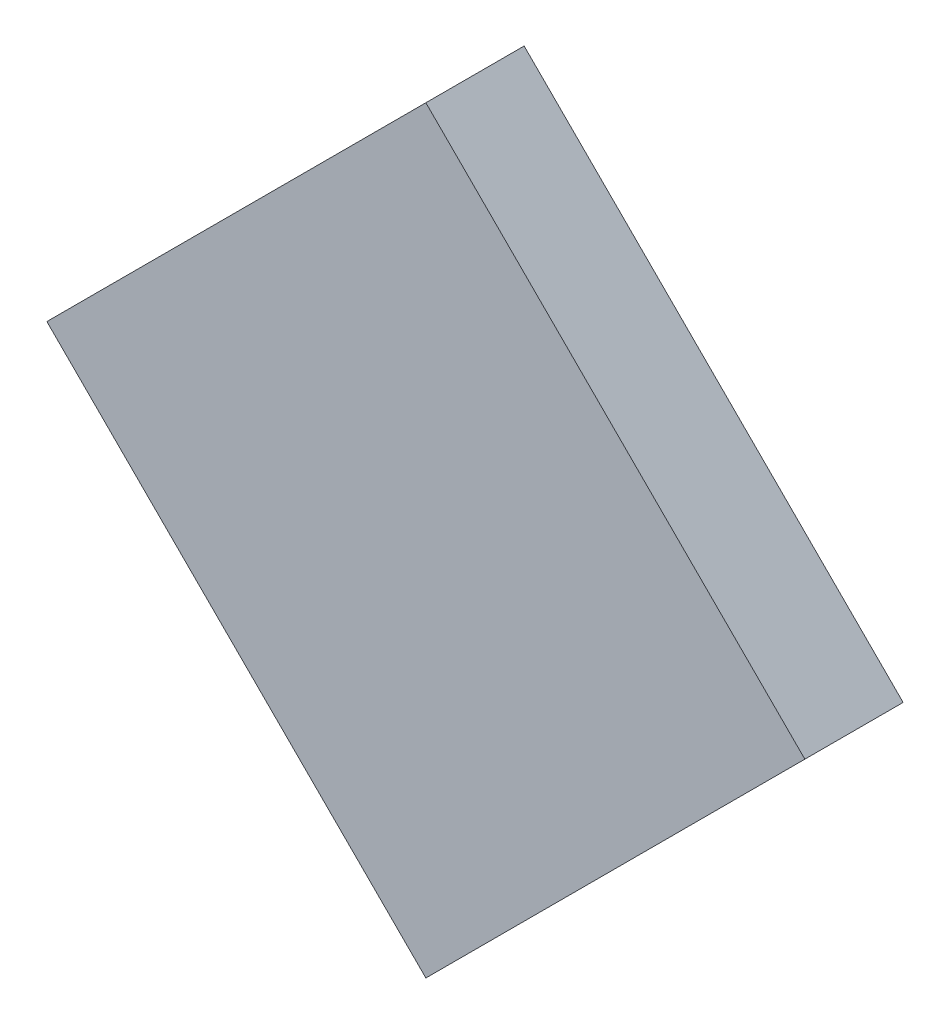
ISO-10303-21;
HEADER;
FILE_DESCRIPTION(('STEP AP214'),'2;1');
FILE_NAME('part.step','',(''),(''),'','','');
FILE_SCHEMA(('AUTOMOTIVE_DESIGN { 1 0 10303 214 1 1 1 1 }'));
ENDSEC;
DATA;
#1=APPLICATION_CONTEXT('core data for automotive mechanical design processes');
#2=APPLICATION_PROTOCOL_DEFINITION('international standard','automotive_design',2000,#1);
#3=PRODUCT_CONTEXT('',#1,'mechanical');
#4=PRODUCT('Part','Part','',(#3));
#5=PRODUCT_RELATED_PRODUCT_CATEGORY('part','',(#4));
#6=PRODUCT_DEFINITION_FORMATION('','',#4);
#7=PRODUCT_DEFINITION_CONTEXT('part definition',#1,'design');
#8=PRODUCT_DEFINITION('design','',#6,#7);
#9=PRODUCT_DEFINITION_SHAPE('','',#8);
#10=(LENGTH_UNIT() NAMED_UNIT(*) SI_UNIT(.MILLI.,.METRE.));
#11=(NAMED_UNIT(*) PLANE_ANGLE_UNIT() SI_UNIT($,.RADIAN.));
#12=(NAMED_UNIT(*) SI_UNIT($,.STERADIAN.) SOLID_ANGLE_UNIT());
#13=UNCERTAINTY_MEASURE_WITH_UNIT(LENGTH_MEASURE(1.E-05),#10,'distance_accuracy_value','');
#14=(GEOMETRIC_REPRESENTATION_CONTEXT(3) GLOBAL_UNCERTAINTY_ASSIGNED_CONTEXT((#13)) GLOBAL_UNIT_ASSIGNED_CONTEXT((#10,
#11,#12)) REPRESENTATION_CONTEXT('',''));
#15=CARTESIAN_POINT('',(0.,0.,0.));
#16=DIRECTION('',(0.,0.,1.));
#17=DIRECTION('',(1.,0.,0.));
#18=AXIS2_PLACEMENT_3D('',#15,#16,#17);
#19=CARTESIAN_POINT('',(212.573593128807,127.720779386421,92.));
#20=DIRECTION('',(0.707106781186547,-0.707106781186548,0.));
#21=DIRECTION('',(0.,0.,-1.));
#22=AXIS2_PLACEMENT_3D('',#19,#20,#21);
#23=PLANE('',#22);
#24=DIRECTION('',(-0.707106781186548,-0.707106781186547,0.));
#25=VECTOR('',#24,1.);
#26=CARTESIAN_POINT('',(297.426406871193,212.573593128807,92.));
#27=LINE('',#26,#25);
#28=CARTESIAN_POINT('',(297.426406871193,212.573593128807,92.));
#29=VERTEX_POINT('',#28);
#30=CARTESIAN_POINT('',(212.573593128807,127.720779386421,92.));
#31=VERTEX_POINT('',#30);
#32=EDGE_CURVE('E20',#29,#31,#27,.T.);
#33=ORIENTED_EDGE('',*,*,#32,.F.);
#34=DIRECTION('',(0.,0.,1.));
#35=VECTOR('',#34,1.);
#36=CARTESIAN_POINT('',(297.426406871193,212.573593128807,92.));
#37=LINE('',#36,#35);
#38=CARTESIAN_POINT('',(297.426406871193,212.573593128807,114.));
#39=VERTEX_POINT('',#38);
#40=EDGE_CURVE('E11',#29,#39,#37,.T.);
#41=ORIENTED_EDGE('',*,*,#40,.T.);
#42=DIRECTION('',(0.707106781186548,0.707106781186547,0.));
#43=VECTOR('',#42,1.);
#44=CARTESIAN_POINT('',(297.426406871193,212.573593128807,114.));
#45=LINE('',#44,#43);
#46=CARTESIAN_POINT('',(212.573593128807,127.720779386421,114.));
#47=VERTEX_POINT('',#46);
#48=EDGE_CURVE('E75',#47,#39,#45,.T.);
#49=ORIENTED_EDGE('',*,*,#48,.F.);
#50=DIRECTION('',(0.,0.,1.));
#51=VECTOR('',#50,1.);
#52=CARTESIAN_POINT('',(212.573593128807,127.720779386421,92.));
#53=LINE('',#52,#51);
#54=EDGE_CURVE('E27',#31,#47,#53,.T.);
#55=ORIENTED_EDGE('',*,*,#54,.F.);
#56=EDGE_LOOP('',(#33,#41,#49,#55));
#57=FACE_BOUND('',#56,.T.);
#58=ADVANCED_FACE('F16',(#57),#23,.T.);
#59=CARTESIAN_POINT('',(127.720779386421,212.573593128807,92.));
#60=DIRECTION('',(-0.707106781186547,-0.707106781186548,0.));
#61=DIRECTION('',(-0.707106781186548,0.707106781186547,0.));
#62=AXIS2_PLACEMENT_3D('',#59,#60,#61);
#63=PLANE('',#62);
#64=DIRECTION('',(-0.707106781186548,0.707106781186547,0.));
#65=VECTOR('',#64,1.);
#66=CARTESIAN_POINT('',(212.573593128807,127.720779386421,92.));
#67=LINE('',#66,#65);
#68=CARTESIAN_POINT('',(127.720779386421,212.573593128807,92.));
#69=VERTEX_POINT('',#68);
#70=EDGE_CURVE('E138',#31,#69,#67,.T.);
#71=ORIENTED_EDGE('',*,*,#70,.F.);
#72=ORIENTED_EDGE('',*,*,#54,.T.);
#73=DIRECTION('',(0.707106781186548,-0.707106781186547,0.));
#74=VECTOR('',#73,1.);
#75=CARTESIAN_POINT('',(212.573593128807,127.720779386421,114.));
#76=LINE('',#75,#74);
#77=CARTESIAN_POINT('',(127.720779386421,212.573593128807,114.));
#78=VERTEX_POINT('',#77);
#79=EDGE_CURVE('E65',#78,#47,#76,.T.);
#80=ORIENTED_EDGE('',*,*,#79,.F.);
#81=DIRECTION('',(0.,0.,1.));
#82=VECTOR('',#81,1.);
#83=CARTESIAN_POINT('',(127.720779386421,212.573593128807,92.));
#84=LINE('',#83,#82);
#85=EDGE_CURVE('E69',#69,#78,#84,.T.);
#86=ORIENTED_EDGE('',*,*,#85,.F.);
#87=EDGE_LOOP('',(#71,#72,#80,#86));
#88=FACE_BOUND('',#87,.T.);
#89=ADVANCED_FACE('F68',(#88),#63,.T.);
#90=CARTESIAN_POINT('',(212.573593128807,297.426406871193,92.));
#91=DIRECTION('',(-0.707106781186548,0.707106781186547,0.));
#92=DIRECTION('',(0.,0.,1.));
#93=AXIS2_PLACEMENT_3D('',#90,#91,#92);
#94=PLANE('',#93);
#95=DIRECTION('',(-0.707106781186547,-0.707106781186548,0.));
#96=VECTOR('',#95,1.);
#97=CARTESIAN_POINT('',(212.573593128807,297.426406871193,92.));
#98=LINE('',#97,#96);
#99=CARTESIAN_POINT('',(212.573593128807,297.426406871193,92.));
#100=VERTEX_POINT('',#99);
#101=EDGE_CURVE('E81',#100,#69,#98,.T.);
#102=ORIENTED_EDGE('',*,*,#101,.T.);
#103=ORIENTED_EDGE('',*,*,#85,.T.);
#104=DIRECTION('',(-0.707106781186547,-0.707106781186548,0.));
#105=VECTOR('',#104,1.);
#106=CARTESIAN_POINT('',(212.573593128807,297.426406871193,114.));
#107=LINE('',#106,#105);
#108=CARTESIAN_POINT('',(212.573593128807,297.426406871193,114.));
#109=VERTEX_POINT('',#108);
#110=EDGE_CURVE('E74',#109,#78,#107,.T.);
#111=ORIENTED_EDGE('',*,*,#110,.F.);
#112=DIRECTION('',(0.,0.,1.));
#113=VECTOR('',#112,1.);
#114=CARTESIAN_POINT('',(212.573593128807,297.426406871193,92.));
#115=LINE('',#114,#113);
#116=EDGE_CURVE('E95',#100,#109,#115,.T.);
#117=ORIENTED_EDGE('',*,*,#116,.F.);
#118=EDGE_LOOP('',(#102,#103,#111,#117));
#119=FACE_BOUND('',#118,.T.);
#120=ADVANCED_FACE('F18',(#119),#94,.T.);
#121=CARTESIAN_POINT('',(297.426406871193,212.573593128807,92.));
#122=DIRECTION('',(0.707106781186547,0.707106781186548,0.));
#123=DIRECTION('',(0.,0.,-1.));
#124=AXIS2_PLACEMENT_3D('',#121,#122,#123);
#125=PLANE('',#124);
#126=DIRECTION('',(-0.707106781186548,0.707106781186547,0.));
#127=VECTOR('',#126,1.);
#128=CARTESIAN_POINT('',(510.,0.,92.));
#129=LINE('',#128,#127);
#130=EDGE_CURVE('E83',#29,#100,#129,.T.);
#131=ORIENTED_EDGE('',*,*,#130,.T.);
#132=ORIENTED_EDGE('',*,*,#116,.T.);
#133=DIRECTION('',(-0.707106781186548,0.707106781186547,0.));
#134=VECTOR('',#133,1.);
#135=CARTESIAN_POINT('',(510.,0.,114.));
#136=LINE('',#135,#134);
#137=EDGE_CURVE('E88',#39,#109,#136,.T.);
#138=ORIENTED_EDGE('',*,*,#137,.F.);
#139=ORIENTED_EDGE('',*,*,#40,.F.);
#140=EDGE_LOOP('',(#131,#132,#138,#139));
#141=FACE_BOUND('',#140,.T.);
#142=ADVANCED_FACE('F149',(#141),#125,.T.);
#143=CARTESIAN_POINT('',(212.573593128807,212.573593128807,114.));
#144=DIRECTION('',(0.,0.,1.));
#145=DIRECTION('',(1.,0.,0.));
#146=AXIS2_PLACEMENT_3D('',#143,#144,#145);
#147=PLANE('',#146);
#148=ORIENTED_EDGE('',*,*,#137,.T.);
#149=ORIENTED_EDGE('',*,*,#110,.T.);
#150=ORIENTED_EDGE('',*,*,#79,.T.);
#151=ORIENTED_EDGE('',*,*,#48,.T.);
#152=EDGE_LOOP('',(#148,#149,#150,#151));
#153=FACE_BOUND('',#152,.T.);
#154=ADVANCED_FACE('F86',(#153),#147,.T.);
#155=CARTESIAN_POINT('',(212.573593128807,212.573593128807,92.));
#156=DIRECTION('',(0.,0.,1.));
#157=DIRECTION('',(1.,0.,0.));
#158=AXIS2_PLACEMENT_3D('',#155,#156,#157);
#159=PLANE('',#158);
#160=ORIENTED_EDGE('',*,*,#130,.F.);
#161=ORIENTED_EDGE('',*,*,#32,.T.);
#162=ORIENTED_EDGE('',*,*,#70,.T.);
#163=ORIENTED_EDGE('',*,*,#101,.F.);
#164=EDGE_LOOP('',(#160,#161,#162,#163));
#165=FACE_BOUND('',#164,.T.);
#166=ADVANCED_FACE('F163',(#165),#159,.F.);
#167=CLOSED_SHELL('',(#58,#89,#120,#142,#154,#166));
#168=MANIFOLD_SOLID_BREP('B1',#167);
#169=ADVANCED_BREP_SHAPE_REPRESENTATION('',(#18,#168),#14);
#170=SHAPE_DEFINITION_REPRESENTATION(#9,#169);
ENDSEC;
END-ISO-10303-21;
